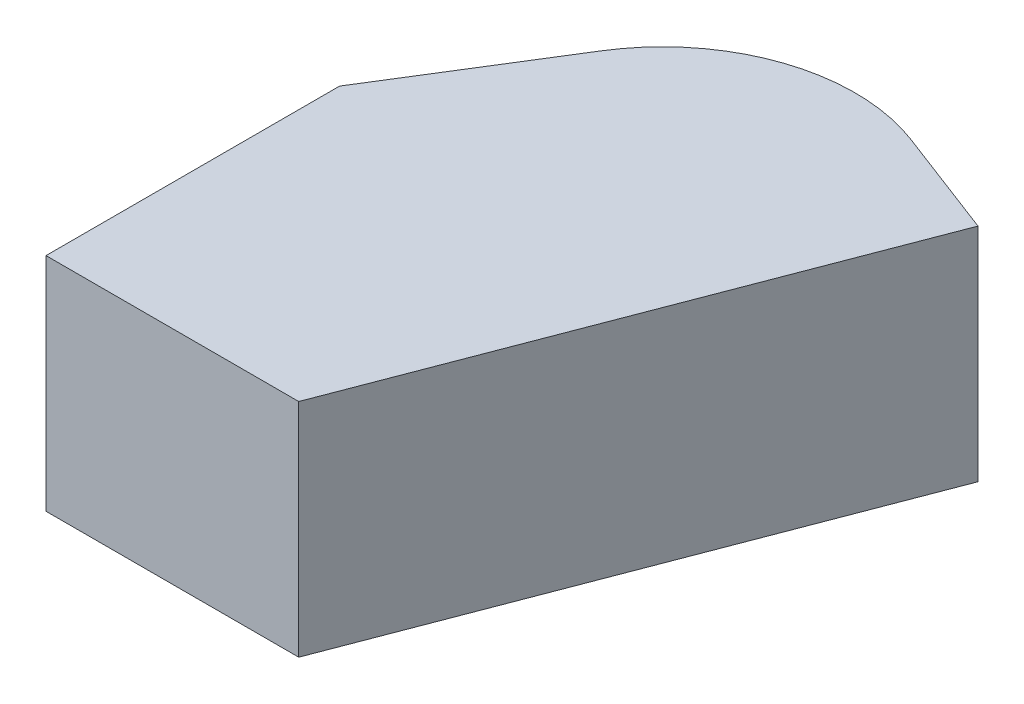
ISO-10303-21;
HEADER;
FILE_DESCRIPTION(('STEP AP214'),'2;1');
FILE_NAME('part.step','',(''),(''),'','','');
FILE_SCHEMA(('AUTOMOTIVE_DESIGN { 1 0 10303 214 1 1 1 1 }'));
ENDSEC;
DATA;
#1=APPLICATION_CONTEXT('core data for automotive mechanical design processes');
#2=APPLICATION_PROTOCOL_DEFINITION('international standard','automotive_design',2000,#1);
#3=PRODUCT_CONTEXT('',#1,'mechanical');
#4=PRODUCT('Part','Part','',(#3));
#5=PRODUCT_RELATED_PRODUCT_CATEGORY('part','',(#4));
#6=PRODUCT_DEFINITION_FORMATION('','',#4);
#7=PRODUCT_DEFINITION_CONTEXT('part definition',#1,'design');
#8=PRODUCT_DEFINITION('design','',#6,#7);
#9=PRODUCT_DEFINITION_SHAPE('','',#8);
#10=(LENGTH_UNIT() NAMED_UNIT(*) SI_UNIT(.MILLI.,.METRE.));
#11=(NAMED_UNIT(*) PLANE_ANGLE_UNIT() SI_UNIT($,.RADIAN.));
#12=(NAMED_UNIT(*) SI_UNIT($,.STERADIAN.) SOLID_ANGLE_UNIT());
#13=UNCERTAINTY_MEASURE_WITH_UNIT(LENGTH_MEASURE(1.E-05),#10,'distance_accuracy_value','');
#14=(GEOMETRIC_REPRESENTATION_CONTEXT(3) GLOBAL_UNCERTAINTY_ASSIGNED_CONTEXT((#13)) GLOBAL_UNIT_ASSIGNED_CONTEXT((#10,
#11,#12)) REPRESENTATION_CONTEXT('',''));
#15=CARTESIAN_POINT('',(0.,0.,0.));
#16=DIRECTION('',(0.,0.,1.));
#17=DIRECTION('',(1.,0.,0.));
#18=AXIS2_PLACEMENT_3D('',#15,#16,#17);
#19=CARTESIAN_POINT('',(-66.6737685117542,58.42,0.));
#20=DIRECTION('',(1.,0.,0.));
#21=DIRECTION('',(0.,0.,-1.));
#22=AXIS2_PLACEMENT_3D('',#19,#20,#21);
#23=PLANE('',#22);
#24=DIRECTION('',(0.,0.,1.));
#25=VECTOR('',#24,1.);
#26=CARTESIAN_POINT('',(-66.6737685117542,0.,0.));
#27=LINE('',#26,#25);
#28=CARTESIAN_POINT('',(-66.6737685117542,0.,0.));
#29=VERTEX_POINT('',#28);
#30=CARTESIAN_POINT('',(-66.6737685117542,0.,77.4518589102709));
#31=VERTEX_POINT('',#30);
#32=EDGE_CURVE('E127',#29,#31,#27,.T.);
#33=ORIENTED_EDGE('',*,*,#32,.T.);
#34=DIRECTION('',(0.,-1.,0.));
#35=VECTOR('',#34,1.);
#36=CARTESIAN_POINT('',(-66.6737685117542,58.42,77.4518589102709));
#37=LINE('',#36,#35);
#38=CARTESIAN_POINT('',(-66.6737685117542,58.42,77.4518589102709));
#39=VERTEX_POINT('',#38);
#40=EDGE_CURVE('E11',#39,#31,#37,.T.);
#41=ORIENTED_EDGE('',*,*,#40,.F.);
#42=DIRECTION('',(0.,0.,1.));
#43=VECTOR('',#42,1.);
#44=CARTESIAN_POINT('',(-66.6737685117542,58.42,0.));
#45=LINE('',#44,#43);
#46=CARTESIAN_POINT('',(-66.6737685117542,58.42,0.));
#47=VERTEX_POINT('',#46);
#48=EDGE_CURVE('E137',#47,#39,#45,.T.);
#49=ORIENTED_EDGE('',*,*,#48,.F.);
#50=DIRECTION('',(0.,-1.,0.));
#51=VECTOR('',#50,1.);
#52=CARTESIAN_POINT('',(-66.6737685117542,58.42,0.));
#53=LINE('',#52,#51);
#54=EDGE_CURVE('E123',#47,#29,#53,.T.);
#55=ORIENTED_EDGE('',*,*,#54,.T.);
#56=EDGE_LOOP('',(#33,#41,#49,#55));
#57=FACE_BOUND('',#56,.T.);
#58=ADVANCED_FACE('F43',(#57),#23,.F.);
#59=CARTESIAN_POINT('',(0.,58.42,77.4518589102709));
#60=DIRECTION('',(0.,0.,-1.));
#61=DIRECTION('',(-1.,0.,0.));
#62=AXIS2_PLACEMENT_3D('',#59,#60,#61);
#63=PLANE('',#62);
#64=DIRECTION('',(1.,0.,0.));
#65=VECTOR('',#64,1.);
#66=CARTESIAN_POINT('',(0.,0.,77.4518589102709));
#67=LINE('',#66,#65);
#68=CARTESIAN_POINT('',(0.,0.,77.4518589102709));
#69=VERTEX_POINT('',#68);
#70=EDGE_CURVE('E130',#31,#69,#67,.T.);
#71=ORIENTED_EDGE('',*,*,#70,.T.);
#72=DIRECTION('',(0.,-1.,0.));
#73=VECTOR('',#72,1.);
#74=CARTESIAN_POINT('',(0.,58.42,77.4518589102709));
#75=LINE('',#74,#73);
#76=CARTESIAN_POINT('',(0.,58.42,77.4518589102709));
#77=VERTEX_POINT('',#76);
#78=EDGE_CURVE('E51',#77,#69,#75,.T.);
#79=ORIENTED_EDGE('',*,*,#78,.F.);
#80=DIRECTION('',(1.,0.,0.));
#81=VECTOR('',#80,1.);
#82=CARTESIAN_POINT('',(0.,58.42,77.4518589102709));
#83=LINE('',#82,#81);
#84=EDGE_CURVE('E96',#39,#77,#83,.T.);
#85=ORIENTED_EDGE('',*,*,#84,.F.);
#86=ORIENTED_EDGE('',*,*,#40,.T.);
#87=EDGE_LOOP('',(#71,#79,#85,#86));
#88=FACE_BOUND('',#87,.T.);
#89=ADVANCED_FACE('F161',(#88),#63,.F.);
#90=CARTESIAN_POINT('',(49.5116484977506,58.42,-52.2240680871758));
#91=DIRECTION('',(-0.934220734492134,0.,-0.356695415228424));
#92=DIRECTION('',(-0.356695415228424,0.,0.934220734492134));
#93=AXIS2_PLACEMENT_3D('',#90,#91,#92);
#94=PLANE('',#93);
#95=DIRECTION('',(0.356695415228424,0.,-0.934220734492134));
#96=VECTOR('',#95,1.);
#97=CARTESIAN_POINT('',(49.5116484977506,0.,-52.2240680871758));
#98=LINE('',#97,#96);
#99=CARTESIAN_POINT('',(49.5116484977506,0.,-52.2240680871758));
#100=VERTEX_POINT('',#99);
#101=EDGE_CURVE('E132',#69,#100,#98,.T.);
#102=ORIENTED_EDGE('',*,*,#101,.T.);
#103=DIRECTION('',(0.,-1.,0.));
#104=VECTOR('',#103,1.);
#105=CARTESIAN_POINT('',(49.5116484977506,58.42,-52.2240680871758));
#106=LINE('',#105,#104);
#107=CARTESIAN_POINT('',(49.5116484977506,58.42,-52.2240680871758));
#108=VERTEX_POINT('',#107);
#109=EDGE_CURVE('E118',#108,#100,#106,.T.);
#110=ORIENTED_EDGE('',*,*,#109,.F.);
#111=DIRECTION('',(0.356695415228424,0.,-0.934220734492134));
#112=VECTOR('',#111,1.);
#113=CARTESIAN_POINT('',(49.5116484977506,58.42,-52.2240680871758));
#114=LINE('',#113,#112);
#115=EDGE_CURVE('E109',#77,#108,#114,.T.);
#116=ORIENTED_EDGE('',*,*,#115,.F.);
#117=ORIENTED_EDGE('',*,*,#78,.T.);
#118=EDGE_LOOP('',(#102,#110,#116,#117));
#119=FACE_BOUND('',#118,.T.);
#120=ADVANCED_FACE('F143',(#119),#94,.F.);
#121=CARTESIAN_POINT('',(20.9897061603201,58.42,-63.1140491051004));
#122=DIRECTION('',(-0.356695415228423,0.,0.934220734492134));
#123=DIRECTION('',(0.934220734492134,0.,0.356695415228423));
#124=AXIS2_PLACEMENT_3D('',#121,#122,#123);
#125=PLANE('',#124);
#126=DIRECTION('',(-0.934220734492134,0.,-0.356695415228423));
#127=VECTOR('',#126,1.);
#128=CARTESIAN_POINT('',(20.9897061603201,0.,-63.1140491051004));
#129=LINE('',#128,#127);
#130=CARTESIAN_POINT('',(20.9897061603201,0.,-63.1140491051004));
#131=VERTEX_POINT('',#130);
#132=EDGE_CURVE('E117',#100,#131,#129,.T.);
#133=ORIENTED_EDGE('',*,*,#132,.T.);
#134=DIRECTION('',(0.,-1.,0.));
#135=VECTOR('',#134,1.);
#136=CARTESIAN_POINT('',(20.9897061603201,58.42,-63.1140491051004));
#137=LINE('',#136,#135);
#138=CARTESIAN_POINT('',(20.9897061603201,58.42,-63.1140491051004));
#139=VERTEX_POINT('',#138);
#140=EDGE_CURVE('E114',#139,#131,#137,.T.);
#141=ORIENTED_EDGE('',*,*,#140,.F.);
#142=DIRECTION('',(-0.934220734492134,0.,-0.356695415228423));
#143=VECTOR('',#142,1.);
#144=CARTESIAN_POINT('',(20.9897061603201,58.42,-63.1140491051004));
#145=LINE('',#144,#143);
#146=EDGE_CURVE('E103',#108,#139,#145,.T.);
#147=ORIENTED_EDGE('',*,*,#146,.F.);
#148=ORIENTED_EDGE('',*,*,#109,.T.);
#149=EDGE_LOOP('',(#133,#141,#147,#148));
#150=FACE_BOUND('',#149,.T.);
#151=ADVANCED_FACE('F115',(#150),#125,.F.);
#152=CARTESIAN_POINT('',(2.8695790667162,58.42,-15.6556357929));
#153=DIRECTION('',(0.,-1.,0.));
#154=DIRECTION('',(0.,0.,-1.));
#155=AXIS2_PLACEMENT_3D('',#152,#153,#154);
#156=CYLINDRICAL_SURFACE('',#155,50.8);
#157=CARTESIAN_POINT('',(2.8695790667162,0.,-15.6556357929));
#158=DIRECTION('',(0.,1.,0.));
#159=DIRECTION('',(0.,0.,-1.));
#160=AXIS2_PLACEMENT_3D('',#157,#158,#159);
#161=CIRCLE('',#160,50.8);
#162=CARTESIAN_POINT('',(-40.2757241052788,0.,-42.4721011490322));
#163=VERTEX_POINT('',#162);
#164=EDGE_CURVE('E82',#131,#163,#161,.T.);
#165=ORIENTED_EDGE('',*,*,#164,.T.);
#166=DIRECTION('',(0.,-1.,0.));
#167=VECTOR('',#166,1.);
#168=CARTESIAN_POINT('',(-40.2757241052788,58.42,-42.4721011490322));
#169=LINE('',#168,#167);
#170=CARTESIAN_POINT('',(-40.2757241052788,58.42,-42.4721011490322));
#171=VERTEX_POINT('',#170);
#172=EDGE_CURVE('E119',#171,#163,#169,.T.);
#173=ORIENTED_EDGE('',*,*,#172,.F.);
#174=CARTESIAN_POINT('',(2.8695790667162,58.42,-15.6556357929));
#175=DIRECTION('',(0.,1.,0.));
#176=DIRECTION('',(0.,0.,-1.));
#177=AXIS2_PLACEMENT_3D('',#174,#175,#176);
#178=CIRCLE('',#177,50.8);
#179=EDGE_CURVE('E107',#139,#171,#178,.T.);
#180=ORIENTED_EDGE('',*,*,#179,.F.);
#181=ORIENTED_EDGE('',*,*,#140,.T.);
#182=EDGE_LOOP('',(#165,#173,#180,#181));
#183=FACE_BOUND('',#182,.T.);
#184=ADVANCED_FACE('F121',(#183),#156,.T.);
#185=CARTESIAN_POINT('',(-66.6737685117542,58.42,0.));
#186=DIRECTION('',(0.849316991574704,0.,0.527883176301816));
#187=DIRECTION('',(0.527883176301816,0.,-0.849316991574704));
#188=AXIS2_PLACEMENT_3D('',#185,#186,#187);
#189=PLANE('',#188);
#190=DIRECTION('',(-0.527883176301816,0.,0.849316991574704));
#191=VECTOR('',#190,1.);
#192=CARTESIAN_POINT('',(-66.6737685117542,0.,0.));
#193=LINE('',#192,#191);
#194=EDGE_CURVE('E88',#163,#29,#193,.T.);
#195=ORIENTED_EDGE('',*,*,#194,.T.);
#196=ORIENTED_EDGE('',*,*,#54,.F.);
#197=DIRECTION('',(-0.527883176301816,0.,0.849316991574704));
#198=VECTOR('',#197,1.);
#199=CARTESIAN_POINT('',(-66.6737685117542,58.42,0.));
#200=LINE('',#199,#198);
#201=EDGE_CURVE('E59',#171,#47,#200,.T.);
#202=ORIENTED_EDGE('',*,*,#201,.F.);
#203=ORIENTED_EDGE('',*,*,#172,.T.);
#204=EDGE_LOOP('',(#195,#196,#202,#203));
#205=FACE_BOUND('',#204,.T.);
#206=ADVANCED_FACE('F150',(#205),#189,.F.);
#207=CARTESIAN_POINT('',(2.8695790667162,58.42,-15.6556357929));
#208=DIRECTION('',(0.,-1.,0.));
#209=DIRECTION('',(0.,0.,-1.));
#210=AXIS2_PLACEMENT_3D('',#207,#208,#209);
#211=PLANE('',#210);
#212=ORIENTED_EDGE('',*,*,#48,.T.);
#213=ORIENTED_EDGE('',*,*,#84,.T.);
#214=ORIENTED_EDGE('',*,*,#115,.T.);
#215=ORIENTED_EDGE('',*,*,#146,.T.);
#216=ORIENTED_EDGE('',*,*,#179,.T.);
#217=ORIENTED_EDGE('',*,*,#201,.T.);
#218=EDGE_LOOP('',(#212,#213,#214,#215,#216,#217));
#219=FACE_BOUND('',#218,.T.);
#220=ADVANCED_FACE('F105',(#219),#211,.F.);
#221=CARTESIAN_POINT('',(2.8695790667162,0.,-15.6556357929));
#222=DIRECTION('',(0.,-1.,0.));
#223=DIRECTION('',(0.,0.,-1.));
#224=AXIS2_PLACEMENT_3D('',#221,#222,#223);
#225=PLANE('',#224);
#226=ORIENTED_EDGE('',*,*,#32,.F.);
#227=ORIENTED_EDGE('',*,*,#194,.F.);
#228=ORIENTED_EDGE('',*,*,#164,.F.);
#229=ORIENTED_EDGE('',*,*,#132,.F.);
#230=ORIENTED_EDGE('',*,*,#101,.F.);
#231=ORIENTED_EDGE('',*,*,#70,.F.);
#232=EDGE_LOOP('',(#226,#227,#228,#229,#230,#231));
#233=FACE_BOUND('',#232,.T.);
#234=ADVANCED_FACE('F146',(#233),#225,.T.);
#235=CLOSED_SHELL('',(#58,#89,#120,#151,#184,#206,#220,#234));
#236=MANIFOLD_SOLID_BREP('B2',#235);
#237=ADVANCED_BREP_SHAPE_REPRESENTATION('',(#18,#236),#14);
#238=SHAPE_DEFINITION_REPRESENTATION(#9,#237);
ENDSEC;
END-ISO-10303-21;
